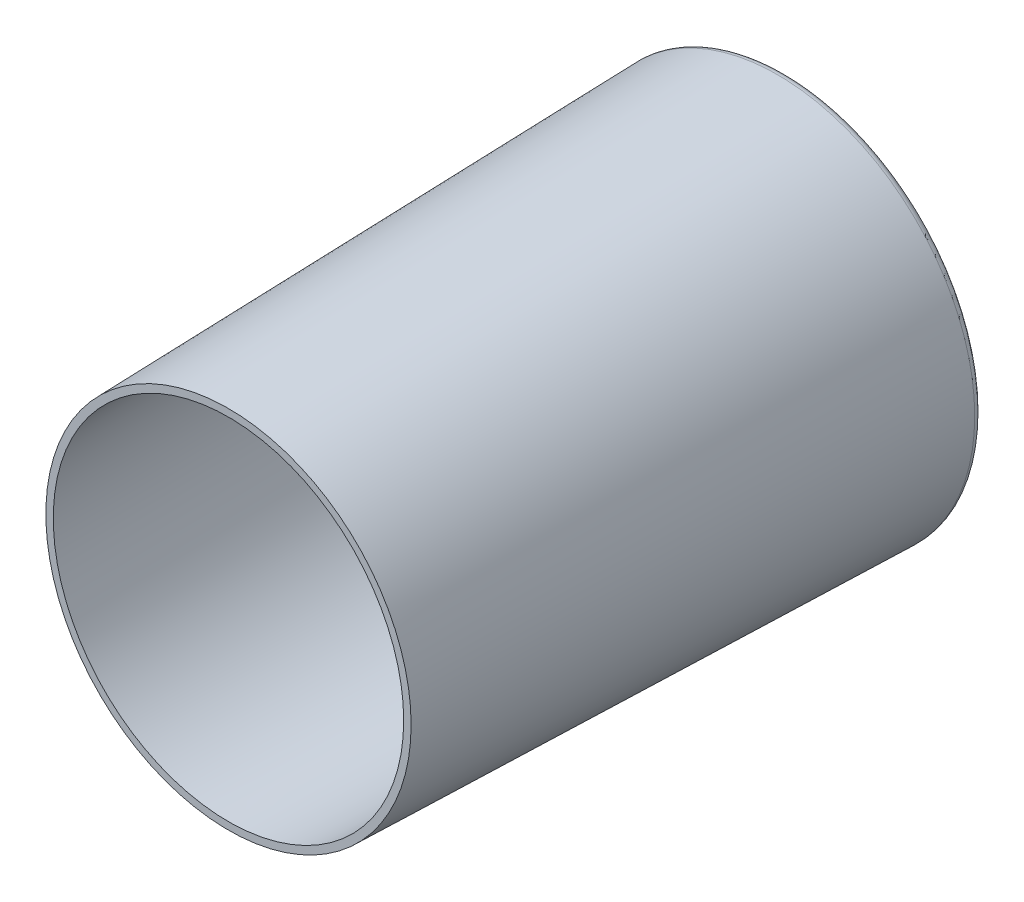
ISO-10303-21;
HEADER;
FILE_DESCRIPTION(('STEP AP214'),'2;1');
FILE_NAME('part.step','',(''),(''),'','','');
FILE_SCHEMA(('AUTOMOTIVE_DESIGN { 1 0 10303 214 1 1 1 1 }'));
ENDSEC;
DATA;
#1=APPLICATION_CONTEXT('core data for automotive mechanical design processes');
#2=APPLICATION_PROTOCOL_DEFINITION('international standard','automotive_design',2000,#1);
#3=PRODUCT_CONTEXT('',#1,'mechanical');
#4=PRODUCT('Part','Part','',(#3));
#5=PRODUCT_RELATED_PRODUCT_CATEGORY('part','',(#4));
#6=PRODUCT_DEFINITION_FORMATION('','',#4);
#7=PRODUCT_DEFINITION_CONTEXT('part definition',#1,'design');
#8=PRODUCT_DEFINITION('design','',#6,#7);
#9=PRODUCT_DEFINITION_SHAPE('','',#8);
#10=(LENGTH_UNIT() NAMED_UNIT(*) SI_UNIT(.MILLI.,.METRE.));
#11=(NAMED_UNIT(*) PLANE_ANGLE_UNIT() SI_UNIT($,.RADIAN.));
#12=(NAMED_UNIT(*) SI_UNIT($,.STERADIAN.) SOLID_ANGLE_UNIT());
#13=UNCERTAINTY_MEASURE_WITH_UNIT(LENGTH_MEASURE(1.E-05),#10,'distance_accuracy_value','');
#14=(GEOMETRIC_REPRESENTATION_CONTEXT(3) GLOBAL_UNCERTAINTY_ASSIGNED_CONTEXT((#13)) GLOBAL_UNIT_ASSIGNED_CONTEXT((#10,
#11,#12)) REPRESENTATION_CONTEXT('',''));
#15=CARTESIAN_POINT('',(0.,0.,0.));
#16=DIRECTION('',(0.,0.,1.));
#17=DIRECTION('',(1.,0.,0.));
#18=AXIS2_PLACEMENT_3D('',#15,#16,#17);
#19=CARTESIAN_POINT('',(-10.948,38.989,0.));
#20=DIRECTION('',(0.,0.,-1.));
#21=DIRECTION('',(1.,0.,0.));
#22=AXIS2_PLACEMENT_3D('',#19,#20,#21);
#23=CONICAL_SURFACE('',#22,49.983,0.026179938779915);
#24=CARTESIAN_POINT('',(-10.948,38.989,-117.948349511337));
#25=DIRECTION('',(0.,0.,-1.));
#26=DIRECTION('',(-1.,0.,0.));
#27=AXIS2_PLACEMENT_3D('',#24,#25,#26);
#28=CIRCLE('',#27,53.0715862295189);
#29=CARTESIAN_POINT('',(-64.0195862295189,38.989,-117.948349511337));
#30=VERTEX_POINT('',#29);
#31=EDGE_CURVE('E10',#30,#30,#28,.F.);
#32=ORIENTED_EDGE('',*,*,#31,.T.);
#33=EDGE_LOOP('',(#32));
#34=FACE_BOUND('',#33,.T.);
#35=CARTESIAN_POINT('',(-10.948,38.989,30.));
#36=DIRECTION('',(0.,0.,1.));
#37=DIRECTION('',(1.,0.,0.));
#38=AXIS2_PLACEMENT_3D('',#35,#36,#37);
#39=CIRCLE('',#38,49.1974223529244);
#40=CARTESIAN_POINT('',(38.2494223529244,38.989,30.));
#41=VERTEX_POINT('',#40);
#42=EDGE_CURVE('E45',#41,#41,#39,.T.);
#43=ORIENTED_EDGE('',*,*,#42,.F.);
#44=EDGE_LOOP('',(#43));
#45=FACE_BOUND('',#44,.T.);
#46=ADVANCED_FACE('F37',(#34,#45),#23,.T.);
#47=CARTESIAN_POINT('',(-10.948,38.989,30.));
#48=DIRECTION('',(0.,0.,1.));
#49=DIRECTION('',(1.,0.,0.));
#50=AXIS2_PLACEMENT_3D('',#47,#48,#49);
#51=PLANE('',#50);
#52=CARTESIAN_POINT('',(-10.948,38.989,30.));
#53=DIRECTION('',(0.,0.,1.));
#54=DIRECTION('',(1.,0.,0.));
#55=AXIS2_PLACEMENT_3D('',#52,#53,#54);
#56=CIRCLE('',#55,47.1974223529244);
#57=CARTESIAN_POINT('',(36.2494223529244,38.989,30.));
#58=VERTEX_POINT('',#57);
#59=EDGE_CURVE('E55',#58,#58,#56,.T.);
#60=ORIENTED_EDGE('',*,*,#59,.F.);
#61=EDGE_LOOP('',(#60));
#62=FACE_BOUND('',#61,.T.);
#63=ORIENTED_EDGE('',*,*,#42,.T.);
#64=EDGE_LOOP('',(#63));
#65=FACE_BOUND('',#64,.T.);
#66=ADVANCED_FACE('F64',(#62,#65),#51,.T.);
#67=CARTESIAN_POINT('',(-10.948,38.989,30.));
#68=DIRECTION('',(0.,0.,-1.));
#69=DIRECTION('',(1.,0.,0.));
#70=AXIS2_PLACEMENT_3D('',#67,#68,#69);
#71=CONICAL_SURFACE('',#70,47.1974223529244,0.026179938779915);
#72=CARTESIAN_POINT('',(-10.948,38.989,-120.));
#73=DIRECTION('',(0.,0.,1.));
#74=DIRECTION('',(1.,0.,0.));
#75=AXIS2_PLACEMENT_3D('',#72,#73,#74);
#76=CIRCLE('',#75,51.1253105883024);
#77=CARTESIAN_POINT('',(40.1773105883024,38.989,-120.));
#78=VERTEX_POINT('',#77);
#79=EDGE_CURVE('E50',#78,#78,#76,.T.);
#80=ORIENTED_EDGE('',*,*,#79,.F.);
#81=EDGE_LOOP('',(#80));
#82=FACE_BOUND('',#81,.T.);
#83=ORIENTED_EDGE('',*,*,#59,.T.);
#84=EDGE_LOOP('',(#83));
#85=FACE_BOUND('',#84,.T.);
#86=ADVANCED_FACE('F62',(#82,#85),#71,.F.);
#87=CARTESIAN_POINT('',(-10.948,38.989,-118.000703407953));
#88=DIRECTION('',(0.,0.,-1.));
#89=DIRECTION('',(-1.,0.,0.));
#90=AXIS2_PLACEMENT_3D('',#87,#88,#89);
#91=TOROIDAL_SURFACE('',#90,51.0722715795678,2.);
#92=ORIENTED_EDGE('',*,*,#79,.T.);
#93=EDGE_LOOP('',(#92));
#94=FACE_BOUND('',#93,.T.);
#95=ORIENTED_EDGE('',*,*,#31,.F.);
#96=EDGE_LOOP('',(#95));
#97=FACE_BOUND('',#96,.T.);
#98=ADVANCED_FACE('F39',(#94,#97),#91,.T.);
#99=CLOSED_SHELL('',(#46,#66,#86,#98));
#100=MANIFOLD_SOLID_BREP('B2',#99);
#101=ADVANCED_BREP_SHAPE_REPRESENTATION('',(#18,#100),#14);
#102=SHAPE_DEFINITION_REPRESENTATION(#9,#101);
ENDSEC;
END-ISO-10303-21;
